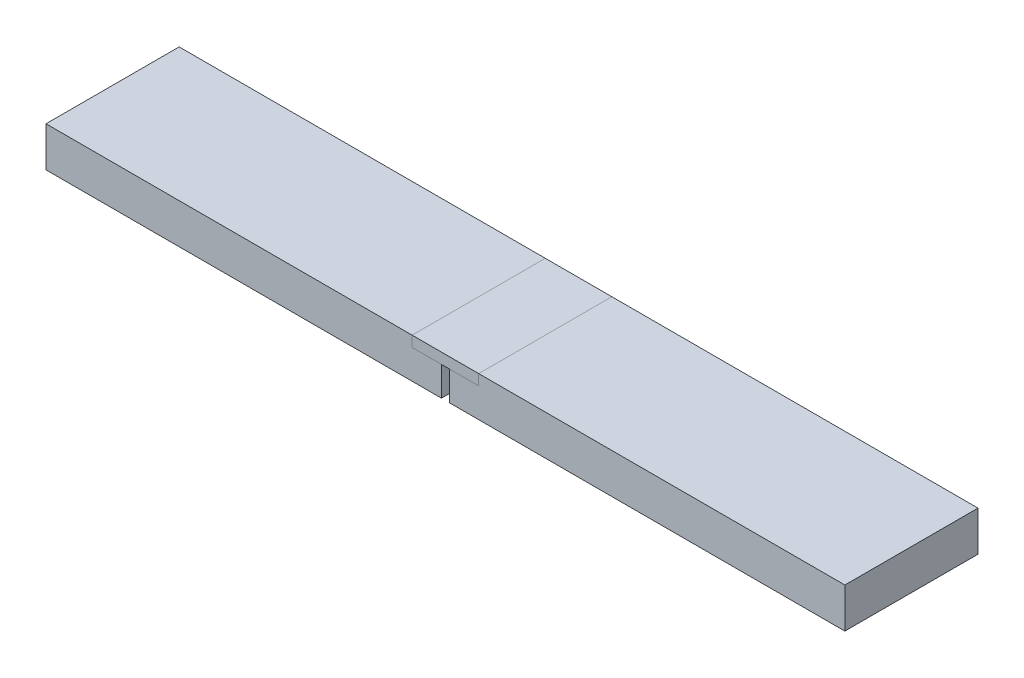
ISO-10303-21;
HEADER;
FILE_DESCRIPTION(('STEP AP214'),'2;1');
FILE_NAME('part.step','',(''),(''),'','','');
FILE_SCHEMA(('AUTOMOTIVE_DESIGN { 1 0 10303 214 1 1 1 1 }'));
ENDSEC;
DATA;
#1=APPLICATION_CONTEXT('core data for automotive mechanical design processes');
#2=APPLICATION_PROTOCOL_DEFINITION('international standard','automotive_design',2000,#1);
#3=PRODUCT_CONTEXT('',#1,'mechanical');
#4=PRODUCT('Part','Part','',(#3));
#5=PRODUCT_RELATED_PRODUCT_CATEGORY('part','',(#4));
#6=PRODUCT_DEFINITION_FORMATION('','',#4);
#7=PRODUCT_DEFINITION_CONTEXT('part definition',#1,'design');
#8=PRODUCT_DEFINITION('design','',#6,#7);
#9=PRODUCT_DEFINITION_SHAPE('','',#8);
#10=(LENGTH_UNIT() NAMED_UNIT(*) SI_UNIT(.MILLI.,.METRE.));
#11=(NAMED_UNIT(*) PLANE_ANGLE_UNIT() SI_UNIT($,.RADIAN.));
#12=(NAMED_UNIT(*) SI_UNIT($,.STERADIAN.) SOLID_ANGLE_UNIT());
#13=UNCERTAINTY_MEASURE_WITH_UNIT(LENGTH_MEASURE(1.E-05),#10,'distance_accuracy_value','');
#14=(GEOMETRIC_REPRESENTATION_CONTEXT(3) GLOBAL_UNCERTAINTY_ASSIGNED_CONTEXT((#13)) GLOBAL_UNIT_ASSIGNED_CONTEXT((#10,
#11,#12)) REPRESENTATION_CONTEXT('',''));
#15=CARTESIAN_POINT('',(0.,0.,0.));
#16=DIRECTION('',(0.,0.,1.));
#17=DIRECTION('',(1.,0.,0.));
#18=AXIS2_PLACEMENT_3D('',#15,#16,#17);
#19=CARTESIAN_POINT('',(6.19565217391305,3.,-1.78260869565217));
#20=DIRECTION('',(1.,0.,0.));
#21=DIRECTION('',(0.,0.,-1.));
#22=AXIS2_PLACEMENT_3D('',#19,#20,#21);
#23=PLANE('',#22);
#24=DIRECTION('',(0.,0.,1.));
#25=VECTOR('',#24,1.);
#26=CARTESIAN_POINT('',(6.19565217391305,2.2,-1.78260869565217));
#27=LINE('',#26,#25);
#28=CARTESIAN_POINT('',(6.19565217391305,2.2,-1.78260869565217));
#29=VERTEX_POINT('',#28);
#30=CARTESIAN_POINT('',(6.19565217391305,2.2,8.21739130434783));
#31=VERTEX_POINT('',#30);
#32=EDGE_CURVE('E121',#29,#31,#27,.T.);
#33=ORIENTED_EDGE('',*,*,#32,.T.);
#34=DIRECTION('',(0.,-1.,0.));
#35=VECTOR('',#34,1.);
#36=CARTESIAN_POINT('',(6.19565217391305,3.,8.21739130434783));
#37=LINE('',#36,#35);
#38=CARTESIAN_POINT('',(6.19565217391305,3.,8.21739130434783));
#39=VERTEX_POINT('',#38);
#40=EDGE_CURVE('E12',#39,#31,#37,.T.);
#41=ORIENTED_EDGE('',*,*,#40,.F.);
#42=DIRECTION('',(0.,0.,1.));
#43=VECTOR('',#42,1.);
#44=CARTESIAN_POINT('',(6.19565217391305,3.,-1.78260869565217));
#45=LINE('',#44,#43);
#46=CARTESIAN_POINT('',(6.19565217391305,3.,-1.78260869565217));
#47=VERTEX_POINT('',#46);
#48=EDGE_CURVE('E109',#47,#39,#45,.T.);
#49=ORIENTED_EDGE('',*,*,#48,.F.);
#50=DIRECTION('',(0.,-1.,0.));
#51=VECTOR('',#50,1.);
#52=CARTESIAN_POINT('',(6.19565217391305,3.,-1.78260869565217));
#53=LINE('',#52,#51);
#54=EDGE_CURVE('E117',#47,#29,#53,.T.);
#55=ORIENTED_EDGE('',*,*,#54,.T.);
#56=EDGE_LOOP('',(#33,#41,#49,#55));
#57=FACE_BOUND('',#56,.T.);
#58=ADVANCED_FACE('F58',(#57),#23,.F.);
#59=CARTESIAN_POINT('',(6.19565217391305,3.,8.21739130434783));
#60=DIRECTION('',(0.,0.,-1.));
#61=DIRECTION('',(-1.,0.,0.));
#62=AXIS2_PLACEMENT_3D('',#59,#60,#61);
#63=PLANE('',#62);
#64=DIRECTION('',(1.,0.,0.));
#65=VECTOR('',#64,1.);
#66=CARTESIAN_POINT('',(6.19565217391305,2.2,8.21739130434783));
#67=LINE('',#66,#65);
#68=CARTESIAN_POINT('',(11.1956521739131,2.2,8.21739130434783));
#69=VERTEX_POINT('',#68);
#70=EDGE_CURVE('E113',#31,#69,#67,.T.);
#71=ORIENTED_EDGE('',*,*,#70,.T.);
#72=DIRECTION('',(0.,-1.,0.));
#73=VECTOR('',#72,1.);
#74=CARTESIAN_POINT('',(11.1956521739131,3.,8.21739130434783));
#75=LINE('',#74,#73);
#76=CARTESIAN_POINT('',(11.1956521739131,3.,8.21739130434783));
#77=VERTEX_POINT('',#76);
#78=EDGE_CURVE('E66',#77,#69,#75,.T.);
#79=ORIENTED_EDGE('',*,*,#78,.F.);
#80=DIRECTION('',(1.,0.,0.));
#81=VECTOR('',#80,1.);
#82=CARTESIAN_POINT('',(6.19565217391305,3.,8.21739130434783));
#83=LINE('',#82,#81);
#84=EDGE_CURVE('E104',#39,#77,#83,.T.);
#85=ORIENTED_EDGE('',*,*,#84,.F.);
#86=ORIENTED_EDGE('',*,*,#40,.T.);
#87=EDGE_LOOP('',(#71,#79,#85,#86));
#88=FACE_BOUND('',#87,.T.);
#89=ADVANCED_FACE('F112',(#88),#63,.F.);
#90=CARTESIAN_POINT('',(11.1956521739131,3.,-1.78260869565217));
#91=DIRECTION('',(-1.,0.,0.));
#92=DIRECTION('',(0.,0.,1.));
#93=AXIS2_PLACEMENT_3D('',#90,#91,#92);
#94=PLANE('',#93);
#95=DIRECTION('',(0.,0.,-1.));
#96=VECTOR('',#95,1.);
#97=CARTESIAN_POINT('',(11.1956521739131,2.2,-1.78260869565217));
#98=LINE('',#97,#96);
#99=CARTESIAN_POINT('',(11.1956521739131,2.2,-1.78260869565217));
#100=VERTEX_POINT('',#99);
#101=EDGE_CURVE('E91',#69,#100,#98,.T.);
#102=ORIENTED_EDGE('',*,*,#101,.T.);
#103=DIRECTION('',(0.,-1.,0.));
#104=VECTOR('',#103,1.);
#105=CARTESIAN_POINT('',(11.1956521739131,3.,-1.78260869565217));
#106=LINE('',#105,#104);
#107=CARTESIAN_POINT('',(11.1956521739131,3.,-1.78260869565217));
#108=VERTEX_POINT('',#107);
#109=EDGE_CURVE('E114',#108,#100,#106,.T.);
#110=ORIENTED_EDGE('',*,*,#109,.F.);
#111=DIRECTION('',(0.,0.,-1.));
#112=VECTOR('',#111,1.);
#113=CARTESIAN_POINT('',(11.1956521739131,3.,-1.78260869565217));
#114=LINE('',#113,#112);
#115=EDGE_CURVE('E107',#77,#108,#114,.T.);
#116=ORIENTED_EDGE('',*,*,#115,.F.);
#117=ORIENTED_EDGE('',*,*,#78,.T.);
#118=EDGE_LOOP('',(#102,#110,#116,#117));
#119=FACE_BOUND('',#118,.T.);
#120=ADVANCED_FACE('F115',(#119),#94,.F.);
#121=CARTESIAN_POINT('',(6.19565217391305,3.,-1.78260869565217));
#122=DIRECTION('',(0.,0.,1.));
#123=DIRECTION('',(1.,0.,0.));
#124=AXIS2_PLACEMENT_3D('',#121,#122,#123);
#125=PLANE('',#124);
#126=DIRECTION('',(-1.,0.,0.));
#127=VECTOR('',#126,1.);
#128=CARTESIAN_POINT('',(6.19565217391305,2.2,-1.78260869565217));
#129=LINE('',#128,#127);
#130=EDGE_CURVE('E97',#100,#29,#129,.T.);
#131=ORIENTED_EDGE('',*,*,#130,.T.);
#132=ORIENTED_EDGE('',*,*,#54,.F.);
#133=DIRECTION('',(-1.,0.,0.));
#134=VECTOR('',#133,1.);
#135=CARTESIAN_POINT('',(6.19565217391305,3.,-1.78260869565217));
#136=LINE('',#135,#134);
#137=EDGE_CURVE('E74',#108,#47,#136,.T.);
#138=ORIENTED_EDGE('',*,*,#137,.F.);
#139=ORIENTED_EDGE('',*,*,#109,.T.);
#140=EDGE_LOOP('',(#131,#132,#138,#139));
#141=FACE_BOUND('',#140,.T.);
#142=ADVANCED_FACE('F128',(#141),#125,.F.);
#143=CARTESIAN_POINT('',(0.,3.,0.));
#144=DIRECTION('',(0.,1.,0.));
#145=DIRECTION('',(0.,0.,1.));
#146=AXIS2_PLACEMENT_3D('',#143,#144,#145);
#147=PLANE('',#146);
#148=ORIENTED_EDGE('',*,*,#48,.T.);
#149=ORIENTED_EDGE('',*,*,#84,.T.);
#150=ORIENTED_EDGE('',*,*,#115,.T.);
#151=ORIENTED_EDGE('',*,*,#137,.T.);
#152=EDGE_LOOP('',(#148,#149,#150,#151));
#153=FACE_BOUND('',#152,.T.);
#154=ADVANCED_FACE('F105',(#153),#147,.T.);
#155=CARTESIAN_POINT('',(0.,2.2,0.));
#156=DIRECTION('',(0.,1.,0.));
#157=DIRECTION('',(0.,0.,1.));
#158=AXIS2_PLACEMENT_3D('',#155,#156,#157);
#159=PLANE('',#158);
#160=ORIENTED_EDGE('',*,*,#32,.F.);
#161=ORIENTED_EDGE('',*,*,#130,.F.);
#162=ORIENTED_EDGE('',*,*,#101,.F.);
#163=ORIENTED_EDGE('',*,*,#70,.F.);
#164=EDGE_LOOP('',(#160,#161,#162,#163));
#165=FACE_BOUND('',#164,.T.);
#166=ADVANCED_FACE('F131',(#165),#159,.F.);
#167=CLOSED_SHELL('',(#58,#89,#120,#142,#154,#166));
#168=MANIFOLD_SOLID_BREP('B2',#167);
#169=CARTESIAN_POINT('',(-21.3043478260869,3.,8.21739130434783));
#170=DIRECTION('',(0.,0.,-1.));
#171=DIRECTION('',(-1.,0.,0.));
#172=AXIS2_PLACEMENT_3D('',#169,#170,#171);
#173=PLANE('',#172);
#174=DIRECTION('',(1.,0.,0.));
#175=VECTOR('',#174,1.);
#176=CARTESIAN_POINT('',(6.19565217391306,2.2,8.21739130434783));
#177=LINE('',#176,#175);
#178=CARTESIAN_POINT('',(6.19565217391306,2.2,8.21739130434783));
#179=VERTEX_POINT('',#178);
#180=CARTESIAN_POINT('',(8.39565217391305,2.2,8.21739130434783));
#181=VERTEX_POINT('',#180);
#182=EDGE_CURVE('E195',#179,#181,#177,.T.);
#183=ORIENTED_EDGE('',*,*,#182,.F.);
#184=DIRECTION('',(0.,1.,0.));
#185=VECTOR('',#184,1.);
#186=CARTESIAN_POINT('',(6.19565217391306,2.2,8.21739130434783));
#187=LINE('',#186,#185);
#188=CARTESIAN_POINT('',(6.19565217391306,3.,8.21739130434783));
#189=VERTEX_POINT('',#188);
#190=EDGE_CURVE('E264',#179,#189,#187,.T.);
#191=ORIENTED_EDGE('',*,*,#190,.T.);
#192=DIRECTION('',(1.,0.,0.));
#193=VECTOR('',#192,1.);
#194=CARTESIAN_POINT('',(-21.3043478260869,3.,8.21739130434783));
#195=LINE('',#194,#193);
#196=CARTESIAN_POINT('',(-21.3043478260869,3.,8.21739130434783));
#197=VERTEX_POINT('',#196);
#198=EDGE_CURVE('E258',#197,#189,#195,.T.);
#199=ORIENTED_EDGE('',*,*,#198,.F.);
#200=DIRECTION('',(0.,-1.,0.));
#201=VECTOR('',#200,1.);
#202=CARTESIAN_POINT('',(-21.3043478260869,3.,8.21739130434783));
#203=LINE('',#202,#201);
#204=CARTESIAN_POINT('',(-21.3043478260869,0.,8.21739130434783));
#205=VERTEX_POINT('',#204);
#206=EDGE_CURVE('E252',#197,#205,#203,.T.);
#207=ORIENTED_EDGE('',*,*,#206,.T.);
#208=DIRECTION('',(1.,0.,0.));
#209=VECTOR('',#208,1.);
#210=CARTESIAN_POINT('',(-21.3043478260869,0.,8.21739130434783));
#211=LINE('',#210,#209);
#212=CARTESIAN_POINT('',(8.39565217391305,0.,8.21739130434783));
#213=VERTEX_POINT('',#212);
#214=EDGE_CURVE('E255',#205,#213,#211,.T.);
#215=ORIENTED_EDGE('',*,*,#214,.T.);
#216=DIRECTION('',(0.,-1.,0.));
#217=VECTOR('',#216,1.);
#218=CARTESIAN_POINT('',(8.39565217391305,2.2,8.21739130434783));
#219=LINE('',#218,#217);
#220=EDGE_CURVE('E234',#181,#213,#219,.T.);
#221=ORIENTED_EDGE('',*,*,#220,.F.);
#222=EDGE_LOOP('',(#183,#191,#199,#207,#215,#221));
#223=FACE_BOUND('',#222,.T.);
#224=ADVANCED_FACE('F191',(#223),#173,.F.);
#225=CARTESIAN_POINT('',(-21.3043478260869,3.,-1.78260869565217));
#226=DIRECTION('',(0.,0.,-1.));
#227=DIRECTION('',(-1.,0.,0.));
#228=AXIS2_PLACEMENT_3D('',#225,#226,#227);
#229=PLANE('',#228);
#230=DIRECTION('',(0.,1.,0.));
#231=VECTOR('',#230,1.);
#232=CARTESIAN_POINT('',(6.19565217391305,2.2,-1.78260869565217));
#233=LINE('',#232,#231);
#234=CARTESIAN_POINT('',(6.19565217391305,2.2,-1.78260869565217));
#235=VERTEX_POINT('',#234);
#236=CARTESIAN_POINT('',(6.19565217391305,3.,-1.78260869565217));
#237=VERTEX_POINT('',#236);
#238=EDGE_CURVE('E56',#235,#237,#233,.T.);
#239=ORIENTED_EDGE('',*,*,#238,.F.);
#240=DIRECTION('',(-1.,0.,0.));
#241=VECTOR('',#240,1.);
#242=CARTESIAN_POINT('',(6.19565217391305,2.2,-1.78260869565217));
#243=LINE('',#242,#241);
#244=CARTESIAN_POINT('',(8.39565217391305,2.2,-1.78260869565217));
#245=VERTEX_POINT('',#244);
#246=EDGE_CURVE('E223',#245,#235,#243,.T.);
#247=ORIENTED_EDGE('',*,*,#246,.F.);
#248=DIRECTION('',(0.,-1.,0.));
#249=VECTOR('',#248,1.);
#250=CARTESIAN_POINT('',(8.39565217391306,2.2,-1.78260869565217));
#251=LINE('',#250,#249);
#252=CARTESIAN_POINT('',(8.39565217391306,0.,-1.78260869565217));
#253=VERTEX_POINT('',#252);
#254=EDGE_CURVE('E273',#245,#253,#251,.T.);
#255=ORIENTED_EDGE('',*,*,#254,.T.);
#256=DIRECTION('',(1.,0.,0.));
#257=VECTOR('',#256,1.);
#258=CARTESIAN_POINT('',(-21.3043478260869,0.,-1.78260869565217));
#259=LINE('',#258,#257);
#260=CARTESIAN_POINT('',(-21.3043478260869,0.,-1.78260869565217));
#261=VERTEX_POINT('',#260);
#262=EDGE_CURVE('E279',#261,#253,#259,.T.);
#263=ORIENTED_EDGE('',*,*,#262,.F.);
#264=DIRECTION('',(0.,-1.,0.));
#265=VECTOR('',#264,1.);
#266=CARTESIAN_POINT('',(-21.3043478260869,3.,-1.78260869565217));
#267=LINE('',#266,#265);
#268=CARTESIAN_POINT('',(-21.3043478260869,3.,-1.78260869565217));
#269=VERTEX_POINT('',#268);
#270=EDGE_CURVE('E276',#269,#261,#267,.T.);
#271=ORIENTED_EDGE('',*,*,#270,.F.);
#272=DIRECTION('',(1.,0.,0.));
#273=VECTOR('',#272,1.);
#274=CARTESIAN_POINT('',(-21.3043478260869,3.,-1.78260869565217));
#275=LINE('',#274,#273);
#276=EDGE_CURVE('E285',#269,#237,#275,.T.);
#277=ORIENTED_EDGE('',*,*,#276,.T.);
#278=EDGE_LOOP('',(#239,#247,#255,#263,#271,#277));
#279=FACE_BOUND('',#278,.T.);
#280=ADVANCED_FACE('F315',(#279),#229,.T.);
#281=CARTESIAN_POINT('',(0.,3.,0.));
#282=DIRECTION('',(0.,-1.,0.));
#283=DIRECTION('',(0.,0.,-1.));
#284=AXIS2_PLACEMENT_3D('',#281,#282,#283);
#285=PLANE('',#284);
#286=ORIENTED_EDGE('',*,*,#198,.T.);
#287=DIRECTION('',(0.,0.,1.));
#288=VECTOR('',#287,1.);
#289=CARTESIAN_POINT('',(6.19565217391305,3.,-1.78260869565217));
#290=LINE('',#289,#288);
#291=EDGE_CURVE('E202',#237,#189,#290,.T.);
#292=ORIENTED_EDGE('',*,*,#291,.F.);
#293=ORIENTED_EDGE('',*,*,#276,.F.);
#294=DIRECTION('',(0.,0.,-1.));
#295=VECTOR('',#294,1.);
#296=CARTESIAN_POINT('',(-21.3043478260869,3.,8.21739130434783));
#297=LINE('',#296,#295);
#298=EDGE_CURVE('E283',#197,#269,#297,.T.);
#299=ORIENTED_EDGE('',*,*,#298,.F.);
#300=EDGE_LOOP('',(#286,#292,#293,#299));
#301=FACE_BOUND('',#300,.T.);
#302=ADVANCED_FACE('F318',(#301),#285,.F.);
#303=CARTESIAN_POINT('',(0.,0.,0.));
#304=DIRECTION('',(0.,-1.,0.));
#305=DIRECTION('',(0.,0.,-1.));
#306=AXIS2_PLACEMENT_3D('',#303,#304,#305);
#307=PLANE('',#306);
#308=DIRECTION('',(0.,0.,-1.));
#309=VECTOR('',#308,1.);
#310=CARTESIAN_POINT('',(8.39565217391305,0.,8.21739130434783));
#311=LINE('',#310,#309);
#312=EDGE_CURVE('E271',#213,#253,#311,.T.);
#313=ORIENTED_EDGE('',*,*,#312,.F.);
#314=ORIENTED_EDGE('',*,*,#214,.F.);
#315=DIRECTION('',(0.,0.,-1.));
#316=VECTOR('',#315,1.);
#317=CARTESIAN_POINT('',(-21.3043478260869,0.,8.21739130434783));
#318=LINE('',#317,#316);
#319=EDGE_CURVE('E270',#205,#261,#318,.T.);
#320=ORIENTED_EDGE('',*,*,#319,.T.);
#321=ORIENTED_EDGE('',*,*,#262,.T.);
#322=EDGE_LOOP('',(#313,#314,#320,#321));
#323=FACE_BOUND('',#322,.T.);
#324=ADVANCED_FACE('F268',(#323),#307,.T.);
#325=CARTESIAN_POINT('',(-21.3043478260869,3.,8.21739130434783));
#326=DIRECTION('',(-1.,0.,0.));
#327=DIRECTION('',(0.,0.,1.));
#328=AXIS2_PLACEMENT_3D('',#325,#326,#327);
#329=PLANE('',#328);
#330=ORIENTED_EDGE('',*,*,#319,.F.);
#331=ORIENTED_EDGE('',*,*,#206,.F.);
#332=ORIENTED_EDGE('',*,*,#298,.T.);
#333=ORIENTED_EDGE('',*,*,#270,.T.);
#334=EDGE_LOOP('',(#330,#331,#332,#333));
#335=FACE_BOUND('',#334,.T.);
#336=ADVANCED_FACE('F275',(#335),#329,.T.);
#337=CARTESIAN_POINT('',(8.39565217391305,2.2,8.21739130434783));
#338=DIRECTION('',(-1.,0.,0.));
#339=DIRECTION('',(0.,0.,1.));
#340=AXIS2_PLACEMENT_3D('',#337,#338,#339);
#341=PLANE('',#340);
#342=ORIENTED_EDGE('',*,*,#312,.T.);
#343=ORIENTED_EDGE('',*,*,#254,.F.);
#344=DIRECTION('',(0.,0.,-1.));
#345=VECTOR('',#344,1.);
#346=CARTESIAN_POINT('',(8.39565217391305,2.2,8.21739130434783));
#347=LINE('',#346,#345);
#348=EDGE_CURVE('E227',#181,#245,#347,.T.);
#349=ORIENTED_EDGE('',*,*,#348,.F.);
#350=ORIENTED_EDGE('',*,*,#220,.T.);
#351=EDGE_LOOP('',(#342,#343,#349,#350));
#352=FACE_BOUND('',#351,.T.);
#353=ADVANCED_FACE('F313',(#352),#341,.F.);
#354=CARTESIAN_POINT('',(0.,2.2,0.));
#355=DIRECTION('',(0.,1.,0.));
#356=DIRECTION('',(0.,0.,1.));
#357=AXIS2_PLACEMENT_3D('',#354,#355,#356);
#358=PLANE('',#357);
#359=ORIENTED_EDGE('',*,*,#348,.T.);
#360=ORIENTED_EDGE('',*,*,#246,.T.);
#361=DIRECTION('',(0.,0.,1.));
#362=VECTOR('',#361,1.);
#363=CARTESIAN_POINT('',(6.19565217391305,2.2,-1.78260869565217));
#364=LINE('',#363,#362);
#365=EDGE_CURVE('E304',#235,#179,#364,.T.);
#366=ORIENTED_EDGE('',*,*,#365,.T.);
#367=ORIENTED_EDGE('',*,*,#182,.T.);
#368=EDGE_LOOP('',(#359,#360,#366,#367));
#369=FACE_BOUND('',#368,.T.);
#370=ADVANCED_FACE('F193',(#369),#358,.T.);
#371=CARTESIAN_POINT('',(6.19565217391305,2.2,-1.78260869565217));
#372=DIRECTION('',(-1.,0.,0.));
#373=DIRECTION('',(0.,0.,1.));
#374=AXIS2_PLACEMENT_3D('',#371,#372,#373);
#375=PLANE('',#374);
#376=ORIENTED_EDGE('',*,*,#291,.T.);
#377=ORIENTED_EDGE('',*,*,#190,.F.);
#378=ORIENTED_EDGE('',*,*,#365,.F.);
#379=ORIENTED_EDGE('',*,*,#238,.T.);
#380=EDGE_LOOP('',(#376,#377,#378,#379));
#381=FACE_BOUND('',#380,.T.);
#382=ADVANCED_FACE('F319',(#381),#375,.F.);
#383=CLOSED_SHELL('',(#224,#280,#302,#324,#336,#353,#370,#382));
#384=MANIFOLD_SOLID_BREP('B6',#383);
#385=CARTESIAN_POINT('',(38.695652173913,3.,8.21739130434783));
#386=DIRECTION('',(-1.,0.,0.));
#387=DIRECTION('',(0.,0.,1.));
#388=AXIS2_PLACEMENT_3D('',#385,#386,#387);
#389=PLANE('',#388);
#390=DIRECTION('',(0.,0.,-1.));
#391=VECTOR('',#390,1.);
#392=CARTESIAN_POINT('',(38.695652173913,0.,8.21739130434783));
#393=LINE('',#392,#391);
#394=CARTESIAN_POINT('',(38.695652173913,0.,8.21739130434783));
#395=VERTEX_POINT('',#394);
#396=CARTESIAN_POINT('',(38.695652173913,0.,-1.78260869565217));
#397=VERTEX_POINT('',#396);
#398=EDGE_CURVE('E433',#395,#397,#393,.T.);
#399=ORIENTED_EDGE('',*,*,#398,.T.);
#400=DIRECTION('',(0.,-1.,0.));
#401=VECTOR('',#400,1.);
#402=CARTESIAN_POINT('',(38.695652173913,3.,-1.78260869565217));
#403=LINE('',#402,#401);
#404=CARTESIAN_POINT('',(38.695652173913,3.,-1.78260869565217));
#405=VERTEX_POINT('',#404);
#406=EDGE_CURVE('E389',#405,#397,#403,.T.);
#407=ORIENTED_EDGE('',*,*,#406,.F.);
#408=DIRECTION('',(0.,0.,-1.));
#409=VECTOR('',#408,1.);
#410=CARTESIAN_POINT('',(38.695652173913,3.,8.21739130434783));
#411=LINE('',#410,#409);
#412=CARTESIAN_POINT('',(38.695652173913,3.,8.21739130434783));
#413=VERTEX_POINT('',#412);
#414=EDGE_CURVE('E438',#413,#405,#411,.T.);
#415=ORIENTED_EDGE('',*,*,#414,.F.);
#416=DIRECTION('',(0.,-1.,0.));
#417=VECTOR('',#416,1.);
#418=CARTESIAN_POINT('',(38.695652173913,3.,8.21739130434783));
#419=LINE('',#418,#417);
#420=EDGE_CURVE('E189',#413,#395,#419,.T.);
#421=ORIENTED_EDGE('',*,*,#420,.T.);
#422=EDGE_LOOP('',(#399,#407,#415,#421));
#423=FACE_BOUND('',#422,.T.);
#424=ADVANCED_FACE('F385',(#423),#389,.F.);
#425=CARTESIAN_POINT('',(0.,0.,0.));
#426=DIRECTION('',(0.,-1.,0.));
#427=DIRECTION('',(0.,0.,-1.));
#428=AXIS2_PLACEMENT_3D('',#425,#426,#427);
#429=PLANE('',#428);
#430=DIRECTION('',(0.,0.,1.));
#431=VECTOR('',#430,1.);
#432=CARTESIAN_POINT('',(8.99565217391305,0.,8.21739130434783));
#433=LINE('',#432,#431);
#434=CARTESIAN_POINT('',(8.99565217391305,0.,-1.78260869565217));
#435=VERTEX_POINT('',#434);
#436=CARTESIAN_POINT('',(8.99565217391305,0.,8.21739130434783));
#437=VERTEX_POINT('',#436);
#438=EDGE_CURVE('E452',#435,#437,#433,.T.);
#439=ORIENTED_EDGE('',*,*,#438,.F.);
#440=DIRECTION('',(1.,0.,0.));
#441=VECTOR('',#440,1.);
#442=CARTESIAN_POINT('',(-21.3043478260869,0.,-1.78260869565217));
#443=LINE('',#442,#441);
#444=EDGE_CURVE('E441',#435,#397,#443,.T.);
#445=ORIENTED_EDGE('',*,*,#444,.T.);
#446=ORIENTED_EDGE('',*,*,#398,.F.);
#447=DIRECTION('',(1.,0.,0.));
#448=VECTOR('',#447,1.);
#449=CARTESIAN_POINT('',(-21.3043478260869,0.,8.21739130434783));
#450=LINE('',#449,#448);
#451=EDGE_CURVE('E423',#437,#395,#450,.T.);
#452=ORIENTED_EDGE('',*,*,#451,.F.);
#453=EDGE_LOOP('',(#439,#445,#446,#452));
#454=FACE_BOUND('',#453,.T.);
#455=ADVANCED_FACE('F439',(#454),#429,.T.);
#456=CARTESIAN_POINT('',(8.99565217391305,2.2,8.21739130434783));
#457=DIRECTION('',(1.,0.,0.));
#458=DIRECTION('',(0.,0.,-1.));
#459=AXIS2_PLACEMENT_3D('',#456,#457,#458);
#460=PLANE('',#459);
#461=ORIENTED_EDGE('',*,*,#438,.T.);
#462=DIRECTION('',(0.,-1.,0.));
#463=VECTOR('',#462,1.);
#464=CARTESIAN_POINT('',(8.99565217391305,2.2,8.21739130434783));
#465=LINE('',#464,#463);
#466=CARTESIAN_POINT('',(8.99565217391305,2.2,8.21739130434783));
#467=VERTEX_POINT('',#466);
#468=EDGE_CURVE('E429',#467,#437,#465,.T.);
#469=ORIENTED_EDGE('',*,*,#468,.F.);
#470=DIRECTION('',(0.,0.,1.));
#471=VECTOR('',#470,1.);
#472=CARTESIAN_POINT('',(8.99565217391305,2.2,8.21739130434783));
#473=LINE('',#472,#471);
#474=CARTESIAN_POINT('',(8.99565217391305,2.2,-1.78260869565217));
#475=VERTEX_POINT('',#474);
#476=EDGE_CURVE('E450',#475,#467,#473,.T.);
#477=ORIENTED_EDGE('',*,*,#476,.F.);
#478=DIRECTION('',(0.,-1.,0.));
#479=VECTOR('',#478,1.);
#480=CARTESIAN_POINT('',(8.99565217391305,2.2,-1.78260869565217));
#481=LINE('',#480,#479);
#482=EDGE_CURVE('E400',#475,#435,#481,.T.);
#483=ORIENTED_EDGE('',*,*,#482,.T.);
#484=EDGE_LOOP('',(#461,#469,#477,#483));
#485=FACE_BOUND('',#484,.T.);
#486=ADVANCED_FACE('F492',(#485),#460,.F.);
#487=CARTESIAN_POINT('',(0.,3.,0.));
#488=DIRECTION('',(0.,-1.,0.));
#489=DIRECTION('',(0.,0.,-1.));
#490=AXIS2_PLACEMENT_3D('',#487,#488,#489);
#491=PLANE('',#490);
#492=DIRECTION('',(1.,0.,0.));
#493=VECTOR('',#492,1.);
#494=CARTESIAN_POINT('',(-21.3043478260869,3.,-1.78260869565217));
#495=LINE('',#494,#493);
#496=CARTESIAN_POINT('',(11.1956521739131,3.,-1.78260869565217));
#497=VERTEX_POINT('',#496);
#498=EDGE_CURVE('E432',#497,#405,#495,.T.);
#499=ORIENTED_EDGE('',*,*,#498,.F.);
#500=DIRECTION('',(0.,0.,-1.));
#501=VECTOR('',#500,1.);
#502=CARTESIAN_POINT('',(11.1956521739131,3.,-1.78260869565217));
#503=LINE('',#502,#501);
#504=CARTESIAN_POINT('',(11.1956521739131,3.,8.21739130434783));
#505=VERTEX_POINT('',#504);
#506=EDGE_CURVE('E463',#505,#497,#503,.T.);
#507=ORIENTED_EDGE('',*,*,#506,.F.);
#508=DIRECTION('',(1.,0.,0.));
#509=VECTOR('',#508,1.);
#510=CARTESIAN_POINT('',(-21.3043478260869,3.,8.21739130434783));
#511=LINE('',#510,#509);
#512=EDGE_CURVE('E409',#505,#413,#511,.T.);
#513=ORIENTED_EDGE('',*,*,#512,.T.);
#514=ORIENTED_EDGE('',*,*,#414,.T.);
#515=EDGE_LOOP('',(#499,#507,#513,#514));
#516=FACE_BOUND('',#515,.T.);
#517=ADVANCED_FACE('F495',(#516),#491,.F.);
#518=CARTESIAN_POINT('',(-21.3043478260869,3.,-1.78260869565217));
#519=DIRECTION('',(0.,0.,-1.));
#520=DIRECTION('',(-1.,0.,0.));
#521=AXIS2_PLACEMENT_3D('',#518,#519,#520);
#522=PLANE('',#521);
#523=DIRECTION('',(0.,1.,0.));
#524=VECTOR('',#523,1.);
#525=CARTESIAN_POINT('',(11.1956521739131,2.2,-1.78260869565217));
#526=LINE('',#525,#524);
#527=CARTESIAN_POINT('',(11.1956521739131,2.2,-1.78260869565217));
#528=VERTEX_POINT('',#527);
#529=EDGE_CURVE('E454',#528,#497,#526,.T.);
#530=ORIENTED_EDGE('',*,*,#529,.T.);
#531=ORIENTED_EDGE('',*,*,#498,.T.);
#532=ORIENTED_EDGE('',*,*,#406,.T.);
#533=ORIENTED_EDGE('',*,*,#444,.F.);
#534=ORIENTED_EDGE('',*,*,#482,.F.);
#535=DIRECTION('',(-1.,0.,0.));
#536=VECTOR('',#535,1.);
#537=CARTESIAN_POINT('',(6.19565217391305,2.2,-1.78260869565217));
#538=LINE('',#537,#536);
#539=EDGE_CURVE('E460',#528,#475,#538,.T.);
#540=ORIENTED_EDGE('',*,*,#539,.F.);
#541=EDGE_LOOP('',(#530,#531,#532,#533,#534,#540));
#542=FACE_BOUND('',#541,.T.);
#543=ADVANCED_FACE('F387',(#542),#522,.T.);
#544=CARTESIAN_POINT('',(-21.3043478260869,3.,8.21739130434783));
#545=DIRECTION('',(0.,0.,-1.));
#546=DIRECTION('',(-1.,0.,0.));
#547=AXIS2_PLACEMENT_3D('',#544,#545,#546);
#548=PLANE('',#547);
#549=ORIENTED_EDGE('',*,*,#512,.F.);
#550=DIRECTION('',(0.,1.,0.));
#551=VECTOR('',#550,1.);
#552=CARTESIAN_POINT('',(11.1956521739131,2.2,8.21739130434783));
#553=LINE('',#552,#551);
#554=CARTESIAN_POINT('',(11.1956521739131,2.2,8.21739130434783));
#555=VERTEX_POINT('',#554);
#556=EDGE_CURVE('E457',#555,#505,#553,.T.);
#557=ORIENTED_EDGE('',*,*,#556,.F.);
#558=DIRECTION('',(1.,0.,0.));
#559=VECTOR('',#558,1.);
#560=CARTESIAN_POINT('',(6.19565217391306,2.2,8.21739130434783));
#561=LINE('',#560,#559);
#562=EDGE_CURVE('E466',#467,#555,#561,.T.);
#563=ORIENTED_EDGE('',*,*,#562,.F.);
#564=ORIENTED_EDGE('',*,*,#468,.T.);
#565=ORIENTED_EDGE('',*,*,#451,.T.);
#566=ORIENTED_EDGE('',*,*,#420,.F.);
#567=EDGE_LOOP('',(#549,#557,#563,#564,#565,#566));
#568=FACE_BOUND('',#567,.T.);
#569=ADVANCED_FACE('F424',(#568),#548,.F.);
#570=CARTESIAN_POINT('',(0.,2.2,0.));
#571=DIRECTION('',(0.,1.,0.));
#572=DIRECTION('',(0.,0.,1.));
#573=AXIS2_PLACEMENT_3D('',#570,#571,#572);
#574=PLANE('',#573);
#575=ORIENTED_EDGE('',*,*,#476,.T.);
#576=ORIENTED_EDGE('',*,*,#562,.T.);
#577=DIRECTION('',(0.,0.,-1.));
#578=VECTOR('',#577,1.);
#579=CARTESIAN_POINT('',(11.1956521739131,2.2,-1.78260869565217));
#580=LINE('',#579,#578);
#581=EDGE_CURVE('E469',#555,#528,#580,.T.);
#582=ORIENTED_EDGE('',*,*,#581,.T.);
#583=ORIENTED_EDGE('',*,*,#539,.T.);
#584=EDGE_LOOP('',(#575,#576,#582,#583));
#585=FACE_BOUND('',#584,.T.);
#586=ADVANCED_FACE('F476',(#585),#574,.T.);
#587=CARTESIAN_POINT('',(11.1956521739131,2.2,-1.78260869565217));
#588=DIRECTION('',(1.,0.,0.));
#589=DIRECTION('',(0.,0.,-1.));
#590=AXIS2_PLACEMENT_3D('',#587,#588,#589);
#591=PLANE('',#590);
#592=ORIENTED_EDGE('',*,*,#506,.T.);
#593=ORIENTED_EDGE('',*,*,#529,.F.);
#594=ORIENTED_EDGE('',*,*,#581,.F.);
#595=ORIENTED_EDGE('',*,*,#556,.T.);
#596=EDGE_LOOP('',(#592,#593,#594,#595));
#597=FACE_BOUND('',#596,.T.);
#598=ADVANCED_FACE('F485',(#597),#591,.F.);
#599=CLOSED_SHELL('',(#424,#455,#486,#517,#543,#569,#586,#598));
#600=MANIFOLD_SOLID_BREP('B50',#599);
#601=ADVANCED_BREP_SHAPE_REPRESENTATION('',(#18,#168,#384,#600),#14);
#602=SHAPE_DEFINITION_REPRESENTATION(#9,#601);
ENDSEC;
END-ISO-10303-21;
